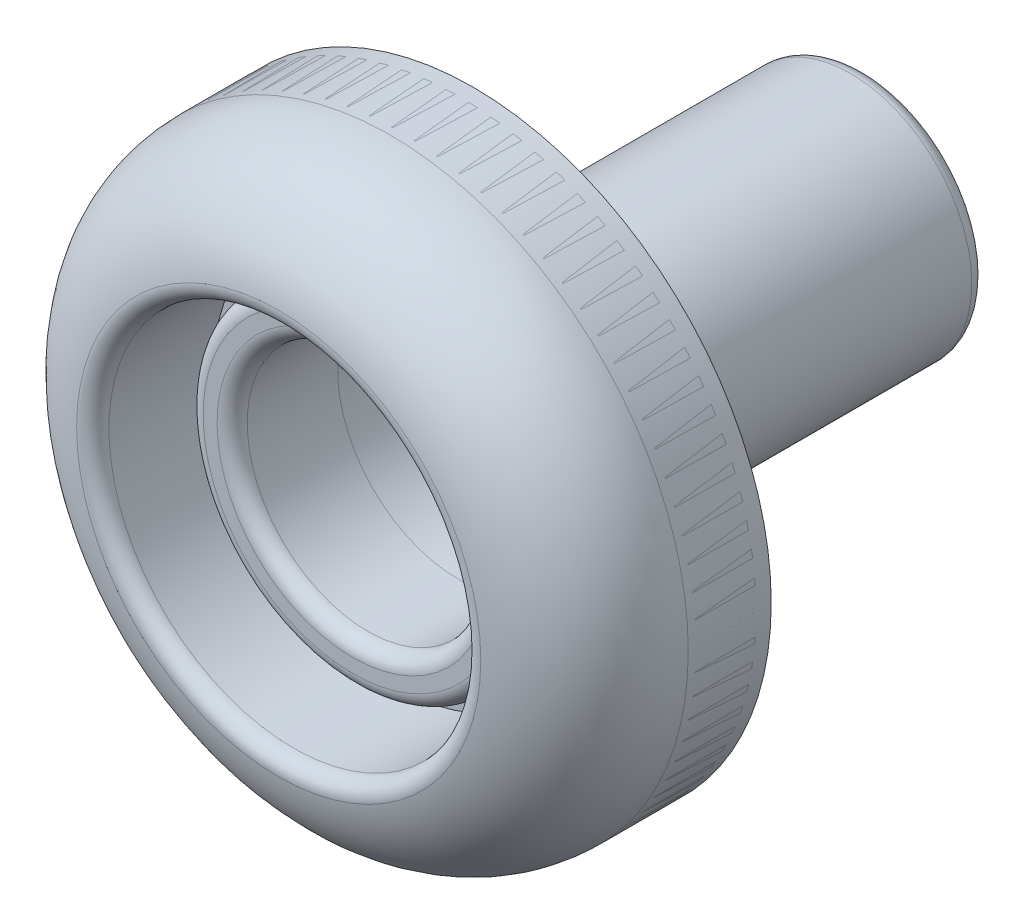
ISO-10303-21;
HEADER;
FILE_DESCRIPTION(('STEP AP214'),'2;1');
FILE_NAME('part.step','',(''),(''),'','','');
FILE_SCHEMA(('AUTOMOTIVE_DESIGN { 1 0 10303 214 1 1 1 1 }'));
ENDSEC;
DATA;
#1=APPLICATION_CONTEXT('core data for automotive mechanical design processes');
#2=APPLICATION_PROTOCOL_DEFINITION('international standard','automotive_design',2000,#1);
#3=PRODUCT_CONTEXT('',#1,'mechanical');
#4=PRODUCT('Part','Part','',(#3));
#5=PRODUCT_RELATED_PRODUCT_CATEGORY('part','',(#4));
#6=PRODUCT_DEFINITION_FORMATION('','',#4);
#7=PRODUCT_DEFINITION_CONTEXT('part definition',#1,'design');
#8=PRODUCT_DEFINITION('design','',#6,#7);
#9=PRODUCT_DEFINITION_SHAPE('','',#8);
#10=(LENGTH_UNIT() NAMED_UNIT(*) SI_UNIT(.MILLI.,.METRE.));
#11=(NAMED_UNIT(*) PLANE_ANGLE_UNIT() SI_UNIT($,.RADIAN.));
#12=(NAMED_UNIT(*) SI_UNIT($,.STERADIAN.) SOLID_ANGLE_UNIT());
#13=UNCERTAINTY_MEASURE_WITH_UNIT(LENGTH_MEASURE(1.E-05),#10,'distance_accuracy_value','');
#14=(GEOMETRIC_REPRESENTATION_CONTEXT(3) GLOBAL_UNCERTAINTY_ASSIGNED_CONTEXT((#13)) GLOBAL_UNIT_ASSIGNED_CONTEXT((#10,
#11,#12)) REPRESENTATION_CONTEXT('',''));
#15=CARTESIAN_POINT('',(0.,0.,0.));
#16=DIRECTION('',(0.,0.,1.));
#17=DIRECTION('',(1.,0.,0.));
#18=AXIS2_PLACEMENT_3D('',#15,#16,#17);
#19=CARTESIAN_POINT('',(0.,0.,-26.));
#20=DIRECTION('',(0.,0.,1.));
#21=DIRECTION('',(-1.,0.,0.));
#22=AXIS2_PLACEMENT_3D('',#19,#20,#21);
#23=PLANE('',#22);
#24=CARTESIAN_POINT('',(0.,0.,-26.));
#25=DIRECTION('',(0.,0.,1.));
#26=DIRECTION('',(1.,0.,0.));
#27=AXIS2_PLACEMENT_3D('',#24,#25,#26);
#28=CIRCLE('',#27,7.04159475822604);
#29=CARTESIAN_POINT('',(7.04159475822604,0.,-26.));
#30=VERTEX_POINT('',#29);
#31=EDGE_CURVE('E12',#30,#30,#28,.F.);
#32=ORIENTED_EDGE('',*,*,#31,.T.);
#33=EDGE_LOOP('',(#32));
#34=FACE_BOUND('',#33,.T.);
#35=CARTESIAN_POINT('',(0.,0.,-26.));
#36=DIRECTION('',(0.,0.,1.));
#37=DIRECTION('',(1.,0.,0.));
#38=AXIS2_PLACEMENT_3D('',#35,#36,#37);
#39=CIRCLE('',#38,1.25348198122553);
#40=CARTESIAN_POINT('',(-1.25348198122553,0.,-26.));
#41=VERTEX_POINT('',#40);
#42=EDGE_CURVE('E73',#41,#41,#39,.T.);
#43=ORIENTED_EDGE('',*,*,#42,.T.);
#44=EDGE_LOOP('',(#43));
#45=FACE_BOUND('',#44,.T.);
#46=ADVANCED_FACE('F51',(#34,#45),#23,.F.);
#47=CARTESIAN_POINT('',(0.,0.,-25.));
#48=DIRECTION('',(0.,0.,1.));
#49=DIRECTION('',(-1.,0.,0.));
#50=AXIS2_PLACEMENT_3D('',#47,#48,#49);
#51=PLANE('',#50);
#52=CARTESIAN_POINT('',(0.,0.,-25.));
#53=DIRECTION('',(0.,0.,-1.));
#54=DIRECTION('',(-1.,0.,0.));
#55=AXIS2_PLACEMENT_3D('',#52,#53,#54);
#56=CIRCLE('',#55,8.04159475822604);
#57=CARTESIAN_POINT('',(8.04159475822604,0.,-25.));
#58=VERTEX_POINT('',#57);
#59=EDGE_CURVE('E59',#58,#58,#56,.T.);
#60=ORIENTED_EDGE('',*,*,#59,.F.);
#61=EDGE_LOOP('',(#60));
#62=FACE_BOUND('',#61,.T.);
#63=CARTESIAN_POINT('',(0.,0.,-25.));
#64=DIRECTION('',(0.,0.,1.));
#65=DIRECTION('',(1.,0.,0.));
#66=AXIS2_PLACEMENT_3D('',#63,#64,#65);
#67=CIRCLE('',#66,1.25348198122553);
#68=CARTESIAN_POINT('',(-1.25348198122553,0.,-25.));
#69=VERTEX_POINT('',#68);
#70=EDGE_CURVE('E68',#69,#69,#67,.T.);
#71=ORIENTED_EDGE('',*,*,#70,.F.);
#72=EDGE_LOOP('',(#71));
#73=FACE_BOUND('',#72,.T.);
#74=ADVANCED_FACE('F79',(#62,#73),#51,.T.);
#75=CARTESIAN_POINT('',(0.,0.,-25.));
#76=DIRECTION('',(0.,0.,1.));
#77=DIRECTION('',(1.,0.,0.));
#78=AXIS2_PLACEMENT_3D('',#75,#76,#77);
#79=CYLINDRICAL_SURFACE('',#78,1.25348198122553);
#80=ORIENTED_EDGE('',*,*,#70,.T.);
#81=EDGE_LOOP('',(#80));
#82=FACE_BOUND('',#81,.T.);
#83=ORIENTED_EDGE('',*,*,#42,.F.);
#84=EDGE_LOOP('',(#83));
#85=FACE_BOUND('',#84,.T.);
#86=ADVANCED_FACE('F77',(#82,#85),#79,.F.);
#87=CARTESIAN_POINT('',(0.,0.,-25.));
#88=DIRECTION('',(0.,0.,1.));
#89=DIRECTION('',(1.,0.,0.));
#90=AXIS2_PLACEMENT_3D('',#87,#88,#89);
#91=TOROIDAL_SURFACE('',#90,7.04159475822604,1.);
#92=ORIENTED_EDGE('',*,*,#59,.T.);
#93=EDGE_LOOP('',(#92));
#94=FACE_BOUND('',#93,.T.);
#95=ORIENTED_EDGE('',*,*,#31,.F.);
#96=EDGE_LOOP('',(#95));
#97=FACE_BOUND('',#96,.T.);
#98=ADVANCED_FACE('F53',(#94,#97),#91,.T.);
#99=CLOSED_SHELL('',(#46,#74,#86,#98));
#100=MANIFOLD_SOLID_BREP('B2',#99);
#101=CARTESIAN_POINT('',(0.,0.,1.));
#102=DIRECTION('',(0.,0.,1.));
#103=DIRECTION('',(-1.,0.,0.));
#104=AXIS2_PLACEMENT_3D('',#101,#102,#103);
#105=PLANE('',#104);
#106=CARTESIAN_POINT('',(0.,0.,1.));
#107=DIRECTION('',(0.,0.,-1.));
#108=DIRECTION('',(-1.,0.,0.));
#109=AXIS2_PLACEMENT_3D('',#106,#107,#108);
#110=CIRCLE('',#109,19.744272898526);
#111=CARTESIAN_POINT('',(19.744272898526,0.,1.));
#112=VERTEX_POINT('',#111);
#113=EDGE_CURVE('E155',#112,#112,#110,.T.);
#114=ORIENTED_EDGE('',*,*,#113,.T.);
#115=EDGE_LOOP('',(#114));
#116=FACE_BOUND('',#115,.T.);
#117=CARTESIAN_POINT('',(0.,0.,1.));
#118=DIRECTION('',(0.,0.,1.));
#119=DIRECTION('',(1.,0.,0.));
#120=AXIS2_PLACEMENT_3D('',#117,#118,#119);
#121=CIRCLE('',#120,8.);
#122=CARTESIAN_POINT('',(8.,0.,1.));
#123=VERTEX_POINT('',#122);
#124=EDGE_CURVE('E147',#123,#123,#121,.T.);
#125=ORIENTED_EDGE('',*,*,#124,.T.);
#126=EDGE_LOOP('',(#125));
#127=FACE_BOUND('',#126,.T.);
#128=ADVANCED_FACE('F125',(#116,#127),#105,.F.);
#129=CARTESIAN_POINT('',(0.,0.,5.));
#130=DIRECTION('',(0.,0.,1.));
#131=DIRECTION('',(-1.,0.,0.));
#132=AXIS2_PLACEMENT_3D('',#129,#130,#131);
#133=PLANE('',#132);
#134=CARTESIAN_POINT('',(0.,0.,5.));
#135=DIRECTION('',(0.,0.,1.));
#136=DIRECTION('',(-1.,0.,0.));
#137=AXIS2_PLACEMENT_3D('',#134,#135,#136);
#138=CIRCLE('',#137,19.744272898526);
#139=CARTESIAN_POINT('',(19.744272898526,0.,5.));
#140=VERTEX_POINT('',#139);
#141=EDGE_CURVE('E139',#140,#140,#138,.T.);
#142=ORIENTED_EDGE('',*,*,#141,.T.);
#143=EDGE_LOOP('',(#142));
#144=FACE_BOUND('',#143,.T.);
#145=CARTESIAN_POINT('',(0.,0.,5.));
#146=DIRECTION('',(0.,0.,-1.));
#147=DIRECTION('',(-1.,0.,0.));
#148=AXIS2_PLACEMENT_3D('',#145,#146,#147);
#149=CIRCLE('',#148,10.9194829363122);
#150=CARTESIAN_POINT('',(10.9194829363122,0.,5.));
#151=VERTEX_POINT('',#150);
#152=EDGE_CURVE('E151',#151,#151,#149,.T.);
#153=ORIENTED_EDGE('',*,*,#152,.T.);
#154=EDGE_LOOP('',(#153));
#155=FACE_BOUND('',#154,.T.);
#156=ADVANCED_FACE('F152',(#144,#155),#133,.T.);
#157=CARTESIAN_POINT('',(0.,0.,5.));
#158=DIRECTION('',(0.,0.,1.));
#159=DIRECTION('',(-1.,0.,0.));
#160=AXIS2_PLACEMENT_3D('',#157,#158,#159);
#161=CYLINDRICAL_SURFACE('',#160,19.744272898526);
#162=ORIENTED_EDGE('',*,*,#141,.F.);
#163=EDGE_LOOP('',(#162));
#164=FACE_BOUND('',#163,.T.);
#165=ORIENTED_EDGE('',*,*,#113,.F.);
#166=EDGE_LOOP('',(#165));
#167=FACE_BOUND('',#166,.T.);
#168=ADVANCED_FACE('F195',(#164,#167),#161,.T.);
#169=CARTESIAN_POINT('',(0.,0.,3.));
#170=DIRECTION('',(0.,0.,1.));
#171=DIRECTION('',(1.,0.,0.));
#172=AXIS2_PLACEMENT_3D('',#169,#170,#171);
#173=CYLINDRICAL_SURFACE('',#172,8.);
#174=CARTESIAN_POINT('',(0.,0.,7.));
#175=DIRECTION('',(0.,0.,1.));
#176=DIRECTION('',(1.,0.,0.));
#177=AXIS2_PLACEMENT_3D('',#174,#175,#176);
#178=CIRCLE('',#177,8.);
#179=CARTESIAN_POINT('',(8.,0.,7.));
#180=VERTEX_POINT('',#179);
#181=EDGE_CURVE('E134',#180,#180,#178,.T.);
#182=ORIENTED_EDGE('',*,*,#181,.T.);
#183=EDGE_LOOP('',(#182));
#184=FACE_BOUND('',#183,.T.);
#185=ORIENTED_EDGE('',*,*,#124,.F.);
#186=EDGE_LOOP('',(#185));
#187=FACE_BOUND('',#186,.T.);
#188=ADVANCED_FACE('F168',(#184,#187),#173,.F.);
#189=CARTESIAN_POINT('',(0.,0.,8.));
#190=DIRECTION('',(0.,0.,1.));
#191=DIRECTION('',(-1.,0.,0.));
#192=AXIS2_PLACEMENT_3D('',#189,#190,#191);
#193=PLANE('',#192);
#194=CARTESIAN_POINT('',(0.,0.,8.));
#195=DIRECTION('',(0.,0.,1.));
#196=DIRECTION('',(1.,0.,0.));
#197=AXIS2_PLACEMENT_3D('',#194,#195,#196);
#198=CIRCLE('',#197,9.);
#199=CARTESIAN_POINT('',(9.,0.,8.));
#200=VERTEX_POINT('',#199);
#201=EDGE_CURVE('E163',#200,#200,#198,.F.);
#202=ORIENTED_EDGE('',*,*,#201,.T.);
#203=EDGE_LOOP('',(#202));
#204=FACE_BOUND('',#203,.T.);
#205=CARTESIAN_POINT('',(0.,0.,8.));
#206=DIRECTION('',(0.,0.,1.));
#207=DIRECTION('',(1.,0.,0.));
#208=AXIS2_PLACEMENT_3D('',#205,#206,#207);
#209=CIRCLE('',#208,9.91948293631224);
#210=CARTESIAN_POINT('',(9.91948293631224,0.,8.));
#211=VERTEX_POINT('',#210);
#212=EDGE_CURVE('E160',#211,#211,#209,.T.);
#213=ORIENTED_EDGE('',*,*,#212,.T.);
#214=EDGE_LOOP('',(#213));
#215=FACE_BOUND('',#214,.T.);
#216=ADVANCED_FACE('F177',(#204,#215),#193,.T.);
#217=CARTESIAN_POINT('',(0.,0.,5.));
#218=DIRECTION('',(0.,0.,-1.));
#219=DIRECTION('',(-1.,0.,0.));
#220=AXIS2_PLACEMENT_3D('',#217,#218,#219);
#221=CYLINDRICAL_SURFACE('',#220,10.9194829363122);
#222=CARTESIAN_POINT('',(0.,0.,7.));
#223=DIRECTION('',(0.,0.,1.));
#224=DIRECTION('',(1.,0.,0.));
#225=AXIS2_PLACEMENT_3D('',#222,#223,#224);
#226=CIRCLE('',#225,10.9194829363122);
#227=CARTESIAN_POINT('',(10.9194829363122,0.,7.));
#228=VERTEX_POINT('',#227);
#229=EDGE_CURVE('E49',#228,#228,#226,.F.);
#230=ORIENTED_EDGE('',*,*,#229,.T.);
#231=EDGE_LOOP('',(#230));
#232=FACE_BOUND('',#231,.T.);
#233=ORIENTED_EDGE('',*,*,#152,.F.);
#234=EDGE_LOOP('',(#233));
#235=FACE_BOUND('',#234,.T.);
#236=ADVANCED_FACE('F174',(#232,#235),#221,.T.);
#237=CARTESIAN_POINT('',(0.,0.,7.));
#238=DIRECTION('',(0.,0.,1.));
#239=DIRECTION('',(1.,0.,0.));
#240=AXIS2_PLACEMENT_3D('',#237,#238,#239);
#241=TOROIDAL_SURFACE('',#240,9.,1.);
#242=ORIENTED_EDGE('',*,*,#181,.F.);
#243=EDGE_LOOP('',(#242));
#244=FACE_BOUND('',#243,.T.);
#245=ORIENTED_EDGE('',*,*,#201,.F.);
#246=EDGE_LOOP('',(#245));
#247=FACE_BOUND('',#246,.T.);
#248=ADVANCED_FACE('F171',(#244,#247),#241,.T.);
#249=CARTESIAN_POINT('',(0.,0.,7.));
#250=DIRECTION('',(0.,0.,1.));
#251=DIRECTION('',(1.,0.,0.));
#252=AXIS2_PLACEMENT_3D('',#249,#250,#251);
#253=TOROIDAL_SURFACE('',#252,9.91948293631224,1.);
#254=ORIENTED_EDGE('',*,*,#229,.F.);
#255=EDGE_LOOP('',(#254));
#256=FACE_BOUND('',#255,.T.);
#257=ORIENTED_EDGE('',*,*,#212,.F.);
#258=EDGE_LOOP('',(#257));
#259=FACE_BOUND('',#258,.T.);
#260=ADVANCED_FACE('F127',(#256,#259),#253,.T.);
#261=CLOSED_SHELL('',(#128,#156,#168,#188,#216,#236,#248,#260));
#262=MANIFOLD_SOLID_BREP('B6',#261);
#263=CARTESIAN_POINT('',(0.,0.,5.));
#264=DIRECTION('',(0.,0.,1.));
#265=DIRECTION('',(-1.,0.,0.));
#266=AXIS2_PLACEMENT_3D('',#263,#264,#265);
#267=CYLINDRICAL_SURFACE('',#266,8.04159475822604);
#268=CARTESIAN_POINT('',(0.,0.,4.));
#269=DIRECTION('',(0.,0.,-1.));
#270=DIRECTION('',(-1.,0.,0.));
#271=AXIS2_PLACEMENT_3D('',#268,#269,#270);
#272=CIRCLE('',#271,8.04159475822604);
#273=CARTESIAN_POINT('',(8.04159475822604,0.,4.));
#274=VERTEX_POINT('',#273);
#275=EDGE_CURVE('E265',#274,#274,#272,.T.);
#276=ORIENTED_EDGE('',*,*,#275,.F.);
#277=EDGE_LOOP('',(#276));
#278=FACE_BOUND('',#277,.T.);
#279=CARTESIAN_POINT('',(0.,0.,-25.));
#280=DIRECTION('',(0.,0.,-1.));
#281=DIRECTION('',(-1.,0.,0.));
#282=AXIS2_PLACEMENT_3D('',#279,#280,#281);
#283=CIRCLE('',#282,8.04159475822604);
#284=CARTESIAN_POINT('',(8.04159475822604,0.,-25.));
#285=VERTEX_POINT('',#284);
#286=EDGE_CURVE('E295',#285,#285,#283,.T.);
#287=ORIENTED_EDGE('',*,*,#286,.T.);
#288=EDGE_LOOP('',(#287));
#289=FACE_BOUND('',#288,.T.);
#290=ADVANCED_FACE('F252',(#278,#289),#267,.F.);
#291=CARTESIAN_POINT('',(0.,0.,4.));
#292=DIRECTION('',(0.,0.,1.));
#293=DIRECTION('',(-1.,0.,0.));
#294=AXIS2_PLACEMENT_3D('',#291,#292,#293);
#295=PLANE('',#294);
#296=ORIENTED_EDGE('',*,*,#275,.T.);
#297=EDGE_LOOP('',(#296));
#298=FACE_BOUND('',#297,.T.);
#299=CARTESIAN_POINT('',(0.,0.,4.));
#300=DIRECTION('',(0.,0.,-1.));
#301=DIRECTION('',(-1.,0.,0.));
#302=AXIS2_PLACEMENT_3D('',#299,#300,#301);
#303=CIRCLE('',#302,12.244272898526);
#304=CARTESIAN_POINT('',(12.244272898526,0.,4.));
#305=VERTEX_POINT('',#304);
#306=EDGE_CURVE('E290',#305,#305,#303,.T.);
#307=ORIENTED_EDGE('',*,*,#306,.F.);
#308=EDGE_LOOP('',(#307));
#309=FACE_BOUND('',#308,.T.);
#310=ADVANCED_FACE('F291',(#298,#309),#295,.T.);
#311=CARTESIAN_POINT('',(0.,0.,-25.));
#312=DIRECTION('',(0.,0.,1.));
#313=DIRECTION('',(-1.,0.,0.));
#314=AXIS2_PLACEMENT_3D('',#311,#312,#313);
#315=PLANE('',#314);
#316=CARTESIAN_POINT('',(0.,0.,-25.));
#317=DIRECTION('',(0.,0.,1.));
#318=DIRECTION('',(1.,0.,0.));
#319=AXIS2_PLACEMENT_3D('',#316,#317,#318);
#320=CIRCLE('',#319,1.25348198122553);
#321=CARTESIAN_POINT('',(-1.25348198122553,0.,-25.));
#322=VERTEX_POINT('',#321);
#323=EDGE_CURVE('E286',#322,#322,#320,.T.);
#324=ORIENTED_EDGE('',*,*,#323,.F.);
#325=EDGE_LOOP('',(#324));
#326=FACE_BOUND('',#325,.T.);
#327=ORIENTED_EDGE('',*,*,#286,.F.);
#328=EDGE_LOOP('',(#327));
#329=FACE_BOUND('',#328,.T.);
#330=ADVANCED_FACE('F328',(#326,#329),#315,.T.);
#331=CARTESIAN_POINT('',(0.,0.,13.));
#332=DIRECTION('',(0.,0.,1.));
#333=DIRECTION('',(-1.,0.,0.));
#334=AXIS2_PLACEMENT_3D('',#331,#332,#333);
#335=CYLINDRICAL_SURFACE('',#334,12.244272898526);
#336=CARTESIAN_POINT('',(0.,0.,11.9226162893326));
#337=DIRECTION('',(0.,0.,1.));
#338=DIRECTION('',(1.,0.,0.));
#339=AXIS2_PLACEMENT_3D('',#336,#337,#338);
#340=CIRCLE('',#339,12.244272898526);
#341=CARTESIAN_POINT('',(12.244272898526,0.,11.9226162893326));
#342=VERTEX_POINT('',#341);
#343=EDGE_CURVE('E123',#342,#342,#340,.T.);
#344=ORIENTED_EDGE('',*,*,#343,.T.);
#345=EDGE_LOOP('',(#344));
#346=FACE_BOUND('',#345,.T.);
#347=ORIENTED_EDGE('',*,*,#306,.T.);
#348=EDGE_LOOP('',(#347));
#349=FACE_BOUND('',#348,.T.);
#350=ADVANCED_FACE('F322',(#346,#349),#335,.F.);
#351=CARTESIAN_POINT('',(0.,0.,5.5));
#352=DIRECTION('',(0.,0.,1.));
#353=DIRECTION('',(1.,0.,0.));
#354=AXIS2_PLACEMENT_3D('',#351,#352,#353);
#355=TOROIDAL_SURFACE('',#354,12.244272898526,7.5);
#356=CARTESIAN_POINT('',(0.,0.,12.9107111030761));
#357=DIRECTION('',(0.,0.,-1.));
#358=DIRECTION('',(-1.,0.,0.));
#359=AXIS2_PLACEMENT_3D('',#356,#357,#358);
#360=CIRCLE('',#359,13.3981190523721);
#361=CARTESIAN_POINT('',(-13.3981190523721,0.,12.9107111030761));
#362=VERTEX_POINT('',#361);
#363=EDGE_CURVE('E259',#362,#362,#360,.T.);
#364=ORIENTED_EDGE('',*,*,#363,.T.);
#365=EDGE_LOOP('',(#364));
#366=FACE_BOUND('',#365,.T.);
#367=CARTESIAN_POINT('',(0.,0.,5.5));
#368=DIRECTION('',(0.,0.,1.));
#369=DIRECTION('',(-1.,0.,0.));
#370=AXIS2_PLACEMENT_3D('',#367,#368,#369);
#371=CIRCLE('',#370,19.744272898526);
#372=CARTESIAN_POINT('',(19.744272898526,0.,5.5));
#373=VERTEX_POINT('',#372);
#374=EDGE_CURVE('E293',#373,#373,#371,.T.);
#375=ORIENTED_EDGE('',*,*,#374,.T.);
#376=EDGE_LOOP('',(#375));
#377=FACE_BOUND('',#376,.T.);
#378=ADVANCED_FACE('F318',(#366,#377),#355,.T.);
#379=CARTESIAN_POINT('',(0.,0.,0.));
#380=DIRECTION('',(0.,0.,-1.));
#381=DIRECTION('',(1.,0.,0.));
#382=AXIS2_PLACEMENT_3D('',#379,#380,#381);
#383=CYLINDRICAL_SURFACE('',#382,19.744272898526);
#384=CARTESIAN_POINT('',(0.,0.,0.));
#385=DIRECTION('',(0.,0.,1.));
#386=DIRECTION('',(1.,0.,0.));
#387=AXIS2_PLACEMENT_3D('',#384,#385,#386);
#388=CIRCLE('',#387,19.744272898526);
#389=CARTESIAN_POINT('',(-19.744272898526,0.,0.));
#390=VERTEX_POINT('',#389);
#391=EDGE_CURVE('E281',#390,#390,#388,.T.);
#392=ORIENTED_EDGE('',*,*,#391,.T.);
#393=EDGE_LOOP('',(#392));
#394=FACE_BOUND('',#393,.T.);
#395=ORIENTED_EDGE('',*,*,#374,.F.);
#396=EDGE_LOOP('',(#395));
#397=FACE_BOUND('',#396,.T.);
#398=ADVANCED_FACE('F314',(#394,#397),#383,.T.);
#399=CARTESIAN_POINT('',(0.,0.,0.));
#400=DIRECTION('',(0.,0.,1.));
#401=DIRECTION('',(1.,0.,0.));
#402=AXIS2_PLACEMENT_3D('',#399,#400,#401);
#403=PLANE('',#402);
#404=CARTESIAN_POINT('',(0.,0.,0.));
#405=DIRECTION('',(0.,0.,1.));
#406=DIRECTION('',(1.,0.,0.));
#407=AXIS2_PLACEMENT_3D('',#404,#405,#406);
#408=CIRCLE('',#407,15.7534819812256);
#409=CARTESIAN_POINT('',(-15.7534819812256,0.,0.));
#410=VERTEX_POINT('',#409);
#411=EDGE_CURVE('E276',#410,#410,#408,.T.);
#412=ORIENTED_EDGE('',*,*,#411,.T.);
#413=EDGE_LOOP('',(#412));
#414=FACE_BOUND('',#413,.T.);
#415=ORIENTED_EDGE('',*,*,#391,.F.);
#416=EDGE_LOOP('',(#415));
#417=FACE_BOUND('',#416,.T.);
#418=ADVANCED_FACE('F317',(#414,#417),#403,.F.);
#419=CARTESIAN_POINT('',(0.,0.,11.9226162893326));
#420=DIRECTION('',(0.,0.,1.));
#421=DIRECTION('',(1.,0.,0.));
#422=AXIS2_PLACEMENT_3D('',#419,#420,#421);
#423=TOROIDAL_SURFACE('',#422,13.244272898526,1.);
#424=ORIENTED_EDGE('',*,*,#343,.F.);
#425=EDGE_LOOP('',(#424));
#426=FACE_BOUND('',#425,.T.);
#427=ORIENTED_EDGE('',*,*,#363,.F.);
#428=EDGE_LOOP('',(#427));
#429=FACE_BOUND('',#428,.T.);
#430=ADVANCED_FACE('F253',(#426,#429),#423,.T.);
#431=OPEN_SHELL('',(#290,#310,#330,#350,#378,#398,#418,#430));
#432=SHELL_BASED_SURFACE_MODEL('B43',(#431));
#433=ADVANCED_BREP_SHAPE_REPRESENTATION('',(#18,#100,#262),#14);
#434=MANIFOLD_SURFACE_SHAPE_REPRESENTATION('',(#18,#432),#14);
#435=SHAPE_REPRESENTATION('',(#18),#14);
#436=SHAPE_DEFINITION_REPRESENTATION(#9,#435);
#437=SHAPE_REPRESENTATION_RELATIONSHIP('','',#435,#433);
#438=SHAPE_REPRESENTATION_RELATIONSHIP('','',#435,#434);
ENDSEC;
END-ISO-10303-21;
